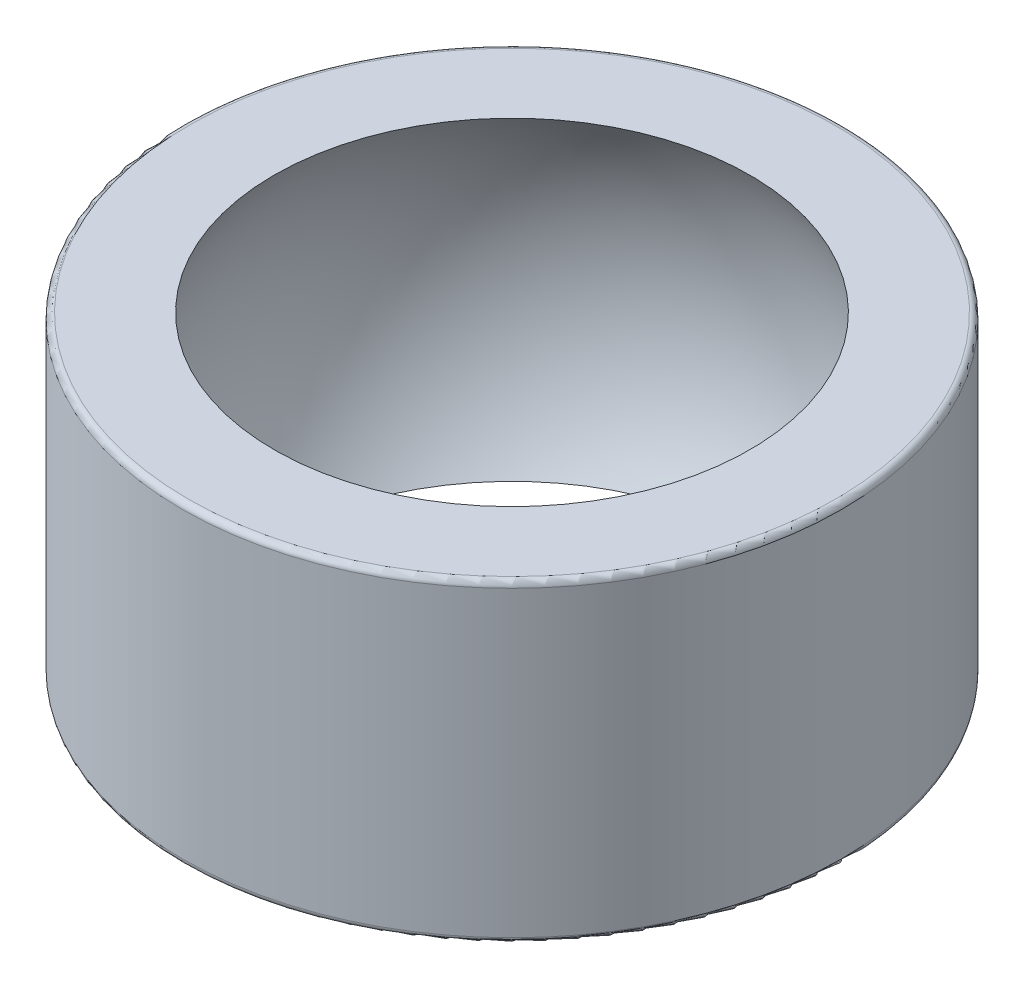
ISO-10303-21;
HEADER;
FILE_DESCRIPTION(('STEP AP214'),'2;1');
FILE_NAME('part.step','',(''),(''),'','','');
FILE_SCHEMA(('AUTOMOTIVE_DESIGN { 1 0 10303 214 1 1 1 1 }'));
ENDSEC;
DATA;
#1=APPLICATION_CONTEXT('core data for automotive mechanical design processes');
#2=APPLICATION_PROTOCOL_DEFINITION('international standard','automotive_design',2000,#1);
#3=PRODUCT_CONTEXT('',#1,'mechanical');
#4=PRODUCT('Part','Part','',(#3));
#5=PRODUCT_RELATED_PRODUCT_CATEGORY('part','',(#4));
#6=PRODUCT_DEFINITION_FORMATION('','',#4);
#7=PRODUCT_DEFINITION_CONTEXT('part definition',#1,'design');
#8=PRODUCT_DEFINITION('design','',#6,#7);
#9=PRODUCT_DEFINITION_SHAPE('','',#8);
#10=(LENGTH_UNIT() NAMED_UNIT(*) SI_UNIT(.MILLI.,.METRE.));
#11=(NAMED_UNIT(*) PLANE_ANGLE_UNIT() SI_UNIT($,.RADIAN.));
#12=(NAMED_UNIT(*) SI_UNIT($,.STERADIAN.) SOLID_ANGLE_UNIT());
#13=UNCERTAINTY_MEASURE_WITH_UNIT(LENGTH_MEASURE(1.E-05),#10,'distance_accuracy_value','');
#14=(GEOMETRIC_REPRESENTATION_CONTEXT(3) GLOBAL_UNCERTAINTY_ASSIGNED_CONTEXT((#13)) GLOBAL_UNIT_ASSIGNED_CONTEXT((#10,
#11,#12)) REPRESENTATION_CONTEXT('',''));
#15=CARTESIAN_POINT('',(0.,0.,0.));
#16=DIRECTION('',(0.,0.,1.));
#17=DIRECTION('',(1.,0.,0.));
#18=AXIS2_PLACEMENT_3D('',#15,#16,#17);
#19=CARTESIAN_POINT('',(0.,5.25,0.));
#20=DIRECTION('',(0.,-1.,0.));
#21=DIRECTION('',(0.,0.,-1.));
#22=AXIS2_PLACEMENT_3D('',#19,#20,#21);
#23=CYLINDRICAL_SURFACE('',#22,11.);
#24=CARTESIAN_POINT('',(0.,-5.05,0.));
#25=DIRECTION('',(0.,1.,0.));
#26=DIRECTION('',(0.,0.,1.));
#27=AXIS2_PLACEMENT_3D('',#24,#25,#26);
#28=CIRCLE('',#27,11.);
#29=CARTESIAN_POINT('',(0.,-5.05,-11.));
#30=VERTEX_POINT('',#29);
#31=EDGE_CURVE('E42',#30,#30,#28,.T.);
#32=CARTESIAN_POINT('',(0.,5.05,0.));
#33=DIRECTION('',(0.,1.,0.));
#34=DIRECTION('',(0.,0.,1.));
#35=AXIS2_PLACEMENT_3D('',#32,#33,#34);
#36=CIRCLE('',#35,11.);
#37=CARTESIAN_POINT('',(0.,5.05,-11.));
#38=VERTEX_POINT('',#37);
#39=EDGE_CURVE('E46',#38,#38,#36,.F.);
#40=CARTESIAN_POINT('',(0.,-5.05,-11.));
#41=CARTESIAN_POINT('',(0.,-4.94479166666667,-11.));
#42=CARTESIAN_POINT('',(0.,-4.83958333333333,-11.));
#43=CARTESIAN_POINT('',(0.,-4.62916666666667,-11.));
#44=CARTESIAN_POINT('',(0.,-4.52395833333333,-11.));
#45=CARTESIAN_POINT('',(0.,-4.31354166666667,-11.));
#46=CARTESIAN_POINT('',(0.,-4.20833333333333,-11.));
#47=CARTESIAN_POINT('',(0.,-3.99791666666667,-11.));
#48=CARTESIAN_POINT('',(0.,-3.89270833333334,-11.));
#49=CARTESIAN_POINT('',(0.,-3.68229166666667,-11.));
#50=CARTESIAN_POINT('',(0.,-3.57708333333334,-11.));
#51=CARTESIAN_POINT('',(0.,-3.36666666666667,-11.));
#52=CARTESIAN_POINT('',(0.,-3.26145833333334,-11.));
#53=CARTESIAN_POINT('',(0.,-3.05104166666667,-11.));
#54=CARTESIAN_POINT('',(0.,-2.94583333333333,-11.));
#55=CARTESIAN_POINT('',(0.,-2.73541666666667,-11.));
#56=CARTESIAN_POINT('',(0.,-2.63020833333333,-11.));
#57=CARTESIAN_POINT('',(0.,-2.41979166666667,-11.));
#58=CARTESIAN_POINT('',(0.,-2.31458333333333,-11.));
#59=CARTESIAN_POINT('',(0.,-2.10416666666667,-11.));
#60=CARTESIAN_POINT('',(0.,-1.99895833333333,-11.));
#61=CARTESIAN_POINT('',(0.,-1.78854166666667,-11.));
#62=CARTESIAN_POINT('',(0.,-1.68333333333333,-11.));
#63=CARTESIAN_POINT('',(0.,-1.47291666666667,-11.));
#64=CARTESIAN_POINT('',(0.,-1.36770833333333,-11.));
#65=CARTESIAN_POINT('',(0.,-1.15729166666667,-11.));
#66=CARTESIAN_POINT('',(0.,-1.05208333333333,-11.));
#67=CARTESIAN_POINT('',(0.,-0.841666666666668,-11.));
#68=CARTESIAN_POINT('',(0.,-0.736458333333334,-11.));
#69=CARTESIAN_POINT('',(0.,-0.526041666666667,-11.));
#70=CARTESIAN_POINT('',(0.,-0.420833333333334,-11.));
#71=CARTESIAN_POINT('',(0.,-0.210416666666668,-11.));
#72=CARTESIAN_POINT('',(0.,-0.105208333333334,-11.));
#73=CARTESIAN_POINT('',(0.,0.105208333333332,-11.));
#74=CARTESIAN_POINT('',(0.,0.210416666666666,-11.));
#75=CARTESIAN_POINT('',(0.,0.420833333333332,-11.));
#76=CARTESIAN_POINT('',(0.,0.526041666666666,-11.));
#77=CARTESIAN_POINT('',(0.,0.736458333333333,-11.));
#78=CARTESIAN_POINT('',(0.,0.841666666666666,-11.));
#79=CARTESIAN_POINT('',(0.,1.05208333333333,-11.));
#80=CARTESIAN_POINT('',(0.,1.15729166666667,-11.));
#81=CARTESIAN_POINT('',(0.,1.36770833333333,-11.));
#82=CARTESIAN_POINT('',(0.,1.47291666666667,-11.));
#83=CARTESIAN_POINT('',(0.,1.68333333333333,-11.));
#84=CARTESIAN_POINT('',(0.,1.78854166666667,-11.));
#85=CARTESIAN_POINT('',(0.,1.99895833333333,-11.));
#86=CARTESIAN_POINT('',(0.,2.10416666666667,-11.));
#87=CARTESIAN_POINT('',(0.,2.31458333333333,-11.));
#88=CARTESIAN_POINT('',(0.,2.41979166666667,-11.));
#89=CARTESIAN_POINT('',(0.,2.63020833333333,-11.));
#90=CARTESIAN_POINT('',(0.,2.73541666666667,-11.));
#91=CARTESIAN_POINT('',(0.,2.94583333333333,-11.));
#92=CARTESIAN_POINT('',(0.,3.05104166666667,-11.));
#93=CARTESIAN_POINT('',(0.,3.26145833333333,-11.));
#94=CARTESIAN_POINT('',(0.,3.36666666666667,-11.));
#95=CARTESIAN_POINT('',(0.,3.57708333333333,-11.));
#96=CARTESIAN_POINT('',(0.,3.68229166666667,-11.));
#97=CARTESIAN_POINT('',(0.,3.89270833333333,-11.));
#98=CARTESIAN_POINT('',(0.,3.99791666666667,-11.));
#99=CARTESIAN_POINT('',(0.,4.20833333333333,-11.));
#100=CARTESIAN_POINT('',(0.,4.31354166666667,-11.));
#101=CARTESIAN_POINT('',(0.,4.52395833333333,-11.));
#102=CARTESIAN_POINT('',(0.,4.62916666666667,-11.));
#103=CARTESIAN_POINT('',(0.,4.83958333333333,-11.));
#104=CARTESIAN_POINT('',(0.,4.94479166666667,-11.));
#105=CARTESIAN_POINT('',(0.,5.05,-11.));
#106=B_SPLINE_CURVE_WITH_KNOTS('',3,(#40,#41,#42,#43,#44,#45,#46,#47,#48,#49,#50,#51,#52,#53,
#54,#55,#56,#57,#58,#59,#60,#61,#62,#63,#64,#65,#66,#67,#68,#69,#70,#71,#72,#73,#74,#75,#76,#77,
#78,#79,#80,#81,#82,#83,#84,#85,#86,#87,#88,#89,#90,#91,#92,#93,#94,#95,#96,#97,#98,#99,#100,
#101,#102,#103,#104,#105),.UNSPECIFIED.,.F.,.F.,(4,2,2,2,2,2,2,2,2,2,2,2,2,2,2,2,2,2,2,2,2,2,2,
2,2,2,2,2,2,2,2,2,4),(0.,0.315625,0.63125,0.946875,1.2625,1.578125,1.89375,2.209375,2.525,
2.840625,3.15625,3.471875,3.7875,4.103125,4.41875,4.734375,5.05,5.365625,5.68125,5.996875,
6.3125,6.628125,6.94375,7.259375,7.575,7.890625,8.20625,8.521875,8.8375,9.153125,9.46875,
9.784375,10.1),.UNSPECIFIED.);
#107=EDGE_CURVE('BSEAM31',#30,#38,#106,.T.);
#108=ORIENTED_EDGE('',*,*,#31,.T.);
#109=ORIENTED_EDGE('',*,*,#39,.T.);
#110=ORIENTED_EDGE('',*,*,#107,.T.);
#111=ORIENTED_EDGE('',*,*,#107,.F.);
#112=EDGE_LOOP('',(#108,#110,#109,#111));
#113=FACE_BOUND('',#112,.T.);
#114=ADVANCED_FACE('F31',(#113),#23,.T.);
#115=CARTESIAN_POINT('',(0.,5.25,0.));
#116=DIRECTION('',(0.,1.,0.));
#117=DIRECTION('',(0.,0.,1.));
#118=AXIS2_PLACEMENT_3D('',#115,#116,#117);
#119=PLANE('',#118);
#120=CARTESIAN_POINT('',(0.,5.25,0.));
#121=DIRECTION('',(0.,1.,0.));
#122=DIRECTION('',(0.,0.,1.));
#123=AXIS2_PLACEMENT_3D('',#120,#121,#122);
#124=CIRCLE('',#123,10.8);
#125=CARTESIAN_POINT('',(0.,5.25,10.8));
#126=VERTEX_POINT('',#125);
#127=EDGE_CURVE('E10',#126,#126,#124,.T.);
#128=ORIENTED_EDGE('',*,*,#127,.T.);
#129=EDGE_LOOP('',(#128));
#130=FACE_BOUND('',#129,.T.);
#131=CARTESIAN_POINT('',(0.,5.25,0.));
#132=DIRECTION('',(0.,1.,0.));
#133=DIRECTION('',(0.,0.,1.));
#134=AXIS2_PLACEMENT_3D('',#131,#132,#133);
#135=CIRCLE('',#134,7.94153007927314);
#136=CARTESIAN_POINT('',(-7.94153007927314,5.25,0.));
#137=VERTEX_POINT('',#136);
#138=EDGE_CURVE('E51',#137,#137,#135,.T.);
#139=ORIENTED_EDGE('',*,*,#138,.F.);
#140=EDGE_LOOP('',(#139));
#141=FACE_BOUND('',#140,.T.);
#142=ADVANCED_FACE('F61',(#130,#141),#119,.T.);
#143=CARTESIAN_POINT('',(0.,-5.25,0.));
#144=DIRECTION('',(0.,1.,0.));
#145=DIRECTION('',(0.,0.,1.));
#146=AXIS2_PLACEMENT_3D('',#143,#144,#145);
#147=PLANE('',#146);
#148=CARTESIAN_POINT('',(0.,-5.25,0.));
#149=DIRECTION('',(0.,1.,0.));
#150=DIRECTION('',(0.,0.,1.));
#151=AXIS2_PLACEMENT_3D('',#148,#149,#150);
#152=CIRCLE('',#151,10.8);
#153=CARTESIAN_POINT('',(0.,-5.25,10.8));
#154=VERTEX_POINT('',#153);
#155=EDGE_CURVE('E38',#154,#154,#152,.F.);
#156=ORIENTED_EDGE('',*,*,#155,.T.);
#157=EDGE_LOOP('',(#156));
#158=FACE_BOUND('',#157,.T.);
#159=CARTESIAN_POINT('',(0.,-5.25,0.));
#160=DIRECTION('',(0.,1.,0.));
#161=DIRECTION('',(0.,0.,1.));
#162=AXIS2_PLACEMENT_3D('',#159,#160,#161);
#163=CIRCLE('',#162,7.94153007927314);
#164=CARTESIAN_POINT('',(-7.94153007927314,-5.25,0.));
#165=VERTEX_POINT('',#164);
#166=EDGE_CURVE('E52',#165,#165,#163,.T.);
#167=ORIENTED_EDGE('',*,*,#166,.T.);
#168=EDGE_LOOP('',(#167));
#169=FACE_BOUND('',#168,.T.);
#170=ADVANCED_FACE('F63',(#158,#169),#147,.F.);
#171=CARTESIAN_POINT('',(0.,0.,0.));
#172=DIRECTION('',(0.,-1.,0.));
#173=DIRECTION('',(-1.,0.,0.));
#174=AXIS2_PLACEMENT_3D('',#171,#172,#173);
#175=SPHERICAL_SURFACE('',#174,9.52);
#176=CARTESIAN_POINT('',(-7.94153007927314,5.25,0.));
#177=CARTESIAN_POINT('',(-8.00541973470951,5.15335771606761,0.));
#178=CARTESIAN_POINT('',(-8.06754358524352,5.05554816758406,0.));
#179=CARTESIAN_POINT('',(-8.18818068038374,4.85772720435516,0.));
#180=CARTESIAN_POINT('',(-8.24669392498995,4.7577157896098,0.));
#181=CARTESIAN_POINT('',(-8.36003081215145,4.55562375669773,0.));
#182=CARTESIAN_POINT('',(-8.41485445470675,4.45354313853102,0.));
#183=CARTESIAN_POINT('',(-8.52073934800305,4.24744890546128,0.));
#184=CARTESIAN_POINT('',(-8.57180059874405,4.14343529055826,0.));
#185=CARTESIAN_POINT('',(-8.670092587233,3.93361363608309,0.));
#186=CARTESIAN_POINT('',(-8.71732332498094,3.82780559651094,0.));
#187=CARTESIAN_POINT('',(-8.80789136371125,3.61453611260506,0.));
#188=CARTESIAN_POINT('',(-8.85122866469361,3.50707466827132,0.));
#189=CARTESIAN_POINT('',(-8.93395207001163,3.2906415830788,0.));
#190=CARTESIAN_POINT('',(-8.97333817434729,3.18166994222002,0.));
#191=CARTESIAN_POINT('',(-9.04810669880715,2.96236168887169,0.));
#192=CARTESIAN_POINT('',(-9.08348911893136,2.85202507638214,0.));
#193=CARTESIAN_POINT('',(-9.15020312124206,2.6301339226473,0.));
#194=CARTESIAN_POINT('',(-9.18153470342854,2.51857938140203,0.));
#195=CARTESIAN_POINT('',(-9.24010527507463,2.29440103642785,0.));
#196=CARTESIAN_POINT('',(-9.26734426453424,2.18177723269895,0.));
#197=CARTESIAN_POINT('',(-9.31769334991523,1.95561045393358,0.));
#198=CARTESIAN_POINT('',(-9.34080344583661,1.84206747889709,0.));
#199=CARTESIAN_POINT('',(-9.38286394584694,1.61421367367226,0.));
#200=CARTESIAN_POINT('',(-9.4018143499359,1.4999028434839,0.));
#201=CARTESIAN_POINT('',(-9.4355302115051,1.27066566740859,0.));
#202=CARTESIAN_POINT('',(-9.45029566898536,1.15573932152164,0.));
#203=CARTESIAN_POINT('',(-9.47562195974691,0.925424273787747,0.));
#204=CARTESIAN_POINT('',(-9.48618279302821,0.810035571940812,0.));
#205=CARTESIAN_POINT('',(-9.50308576120838,0.578949588196486,0.));
#206=CARTESIAN_POINT('',(-9.50942789610725,0.463252306299095,0.));
#207=CARTESIAN_POINT('',(-9.51788501550306,0.231703349601136,0.));
#208=CARTESIAN_POINT('',(-9.52,0.115851674800568,0.));
#209=CARTESIAN_POINT('',(-9.52,-0.115851674800568,0.));
#210=CARTESIAN_POINT('',(-9.51788501550306,-0.231703349601136,0.));
#211=CARTESIAN_POINT('',(-9.50942789610725,-0.463252306299095,0.));
#212=CARTESIAN_POINT('',(-9.50308576120838,-0.578949588196486,0.));
#213=CARTESIAN_POINT('',(-9.48618279302821,-0.810035571940812,0.));
#214=CARTESIAN_POINT('',(-9.47562195974691,-0.925424273787747,0.));
#215=CARTESIAN_POINT('',(-9.45029566898536,-1.15573932152164,0.));
#216=CARTESIAN_POINT('',(-9.4355302115051,-1.27066566740859,0.));
#217=CARTESIAN_POINT('',(-9.4018143499359,-1.4999028434839,0.));
#218=CARTESIAN_POINT('',(-9.38286394584694,-1.61421367367226,0.));
#219=CARTESIAN_POINT('',(-9.34080344583661,-1.84206747889709,0.));
#220=CARTESIAN_POINT('',(-9.31769334991523,-1.95561045393358,0.));
#221=CARTESIAN_POINT('',(-9.26734426453424,-2.18177723269895,0.));
#222=CARTESIAN_POINT('',(-9.24010527507463,-2.29440103642785,0.));
#223=CARTESIAN_POINT('',(-9.18153470342854,-2.51857938140202,0.));
#224=CARTESIAN_POINT('',(-9.15020312124206,-2.6301339226473,0.));
#225=CARTESIAN_POINT('',(-9.08348911893136,-2.85202507638214,0.));
#226=CARTESIAN_POINT('',(-9.04810669880715,-2.96236168887169,0.));
#227=CARTESIAN_POINT('',(-8.97333817434729,-3.18166994222002,0.));
#228=CARTESIAN_POINT('',(-8.93395207001163,-3.2906415830788,0.));
#229=CARTESIAN_POINT('',(-8.85122866469361,-3.50707466827132,0.));
#230=CARTESIAN_POINT('',(-8.80789136371125,-3.61453611260506,0.));
#231=CARTESIAN_POINT('',(-8.71732332498094,-3.82780559651094,0.));
#232=CARTESIAN_POINT('',(-8.670092587233,-3.93361363608309,0.));
#233=CARTESIAN_POINT('',(-8.57180059874405,-4.14343529055826,0.));
#234=CARTESIAN_POINT('',(-8.52073934800305,-4.24744890546129,0.));
#235=CARTESIAN_POINT('',(-8.41485445470675,-4.45354313853102,0.));
#236=CARTESIAN_POINT('',(-8.36003081215145,-4.55562375669773,0.));
#237=CARTESIAN_POINT('',(-8.24669392498995,-4.7577157896098,0.));
#238=CARTESIAN_POINT('',(-8.18818068038374,-4.85772720435516,0.));
#239=CARTESIAN_POINT('',(-8.06754358524352,-5.05554816758406,0.));
#240=CARTESIAN_POINT('',(-8.00541973470951,-5.1533577160676,0.));
#241=CARTESIAN_POINT('',(-7.94153007927314,-5.25,0.));
#242=B_SPLINE_CURVE_WITH_KNOTS('',3,(#176,#177,#178,#179,#180,#181,#182,#183,#184,#185,#186,
#187,#188,#189,#190,#191,#192,#193,#194,#195,#196,#197,#198,#199,#200,#201,#202,#203,#204,#205,
#206,#207,#208,#209,#210,#211,#212,#213,#214,#215,#216,#217,#218,#219,#220,#221,#222,#223,#224,
#225,#226,#227,#228,#229,#230,#231,#232,#233,#234,#235,#236,#237,#238,#239,#240,#241),
.UNSPECIFIED.,.F.,.F.,(4,2,2,2,2,2,2,2,2,2,2,2,2,2,2,2,2,2,2,2,2,2,2,2,2,2,2,2,2,2,2,2,4),(0.,
0.347535726897081,0.695071453794161,1.04260718069124,1.39014290758832,1.7376786344854,
2.08521436138248,2.43275008827956,2.78028581517665,3.12782154207373,3.47535726897081,
3.82289299586789,4.17042872276497,4.51796444966205,4.86550017655913,5.21303590345621,
5.56057163035329,5.90810735725037,6.25564308414745,6.60317881104453,6.95071453794161,
7.29825026483869,7.64578599173577,7.99332171863286,8.34085744552994,8.68839317242702,
9.0359288993241,9.38346462622118,9.73100035311826,10.0785360800153,10.4260718069124,
10.7736075338095,11.1211432607066),.UNSPECIFIED.);
#243=EDGE_CURVE('BSEAM58',#137,#165,#242,.T.);
#244=ORIENTED_EDGE('',*,*,#138,.T.);
#245=ORIENTED_EDGE('',*,*,#166,.F.);
#246=ORIENTED_EDGE('',*,*,#243,.T.);
#247=ORIENTED_EDGE('',*,*,#243,.F.);
#248=EDGE_LOOP('',(#244,#246,#245,#247));
#249=FACE_BOUND('',#248,.T.);
#250=ADVANCED_FACE('F58',(#249),#175,.F.);
#251=CARTESIAN_POINT('',(0.,-5.05,0.));
#252=DIRECTION('',(0.,1.,0.));
#253=DIRECTION('',(0.,0.,1.));
#254=AXIS2_PLACEMENT_3D('',#251,#252,#253);
#255=TOROIDAL_SURFACE('',#254,10.8,0.2);
#256=ORIENTED_EDGE('',*,*,#155,.F.);
#257=EDGE_LOOP('',(#256));
#258=FACE_BOUND('',#257,.T.);
#259=ORIENTED_EDGE('',*,*,#31,.F.);
#260=EDGE_LOOP('',(#259));
#261=FACE_BOUND('',#260,.T.);
#262=ADVANCED_FACE('F73',(#258,#261),#255,.T.);
#263=CARTESIAN_POINT('',(0.,5.05,0.));
#264=DIRECTION('',(0.,1.,0.));
#265=DIRECTION('',(0.,0.,1.));
#266=AXIS2_PLACEMENT_3D('',#263,#264,#265);
#267=TOROIDAL_SURFACE('',#266,10.8,0.2);
#268=ORIENTED_EDGE('',*,*,#39,.F.);
#269=EDGE_LOOP('',(#268));
#270=FACE_BOUND('',#269,.T.);
#271=ORIENTED_EDGE('',*,*,#127,.F.);
#272=EDGE_LOOP('',(#271));
#273=FACE_BOUND('',#272,.T.);
#274=ADVANCED_FACE('F33',(#270,#273),#267,.T.);
#275=CLOSED_SHELL('',(#114,#142,#170,#250,#262,#274));
#276=MANIFOLD_SOLID_BREP('B2',#275);
#277=ADVANCED_BREP_SHAPE_REPRESENTATION('',(#18,#276),#14);
#278=SHAPE_DEFINITION_REPRESENTATION(#9,#277);
ENDSEC;
END-ISO-10303-21;
